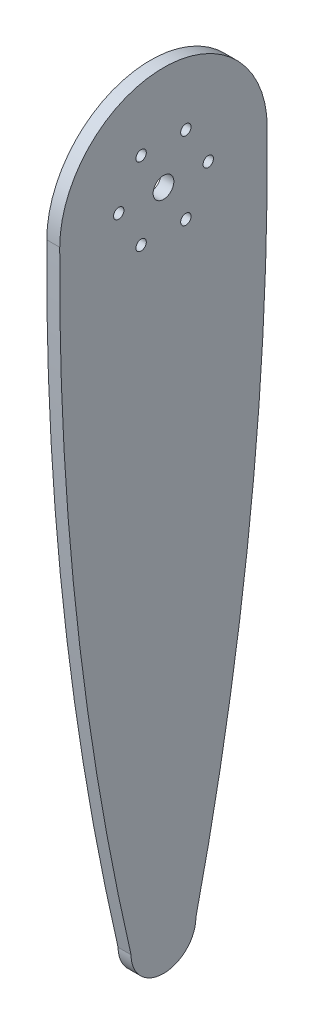
ISO-10303-21;
HEADER;
FILE_DESCRIPTION(('STEP AP214'),'2;1');
FILE_NAME('part.step','',(''),(''),'','','');
FILE_SCHEMA(('AUTOMOTIVE_DESIGN { 1 0 10303 214 1 1 1 1 }'));
ENDSEC;
DATA;
#1=APPLICATION_CONTEXT('core data for automotive mechanical design processes');
#2=APPLICATION_PROTOCOL_DEFINITION('international standard','automotive_design',2000,#1);
#3=PRODUCT_CONTEXT('',#1,'mechanical');
#4=PRODUCT('Part','Part','',(#3));
#5=PRODUCT_RELATED_PRODUCT_CATEGORY('part','',(#4));
#6=PRODUCT_DEFINITION_FORMATION('','',#4);
#7=PRODUCT_DEFINITION_CONTEXT('part definition',#1,'design');
#8=PRODUCT_DEFINITION('design','',#6,#7);
#9=PRODUCT_DEFINITION_SHAPE('','',#8);
#10=(LENGTH_UNIT() NAMED_UNIT(*) SI_UNIT(.MILLI.,.METRE.));
#11=(NAMED_UNIT(*) PLANE_ANGLE_UNIT() SI_UNIT($,.RADIAN.));
#12=(NAMED_UNIT(*) SI_UNIT($,.STERADIAN.) SOLID_ANGLE_UNIT());
#13=UNCERTAINTY_MEASURE_WITH_UNIT(LENGTH_MEASURE(1.E-05),#10,'distance_accuracy_value','');
#14=(GEOMETRIC_REPRESENTATION_CONTEXT(3) GLOBAL_UNCERTAINTY_ASSIGNED_CONTEXT((#13)) GLOBAL_UNIT_ASSIGNED_CONTEXT((#10,
#11,#12)) REPRESENTATION_CONTEXT('',''));
#15=CARTESIAN_POINT('',(0.,0.,0.));
#16=DIRECTION('',(0.,0.,1.));
#17=DIRECTION('',(1.,0.,0.));
#18=AXIS2_PLACEMENT_3D('',#15,#16,#17);
#19=CARTESIAN_POINT('',(5.,241.946907064905,-1036.90370059005));
#20=DIRECTION('',(-1.,0.,0.));
#21=DIRECTION('',(0.,0.,1.));
#22=AXIS2_PLACEMENT_3D('',#19,#20,#21);
#23=CYLINDRICAL_SURFACE('',#22,1076.93381071);
#24=CARTESIAN_POINT('',(0.,241.946907064905,-1036.90370059005));
#25=DIRECTION('',(1.,0.,0.));
#26=DIRECTION('',(0.,0.,-1.));
#27=AXIS2_PLACEMENT_3D('',#24,#25,#26);
#28=CIRCLE('',#27,1076.93381071);
#29=CARTESIAN_POINT('',(0.,250.,40.));
#30=VERTEX_POINT('',#29);
#31=CARTESIAN_POINT('',(0.,0.,12.5));
#32=VERTEX_POINT('',#31);
#33=EDGE_CURVE('E104',#30,#32,#28,.T.);
#34=ORIENTED_EDGE('',*,*,#33,.T.);
#35=DIRECTION('',(-1.,0.,0.));
#36=VECTOR('',#35,1.);
#37=CARTESIAN_POINT('',(5.,0.,12.5));
#38=LINE('',#37,#36);
#39=CARTESIAN_POINT('',(5.,0.,12.5));
#40=VERTEX_POINT('',#39);
#41=EDGE_CURVE('E11',#40,#32,#38,.T.);
#42=ORIENTED_EDGE('',*,*,#41,.F.);
#43=CARTESIAN_POINT('',(5.,241.946907064905,-1036.90370059005));
#44=DIRECTION('',(1.,0.,0.));
#45=DIRECTION('',(0.,0.,-1.));
#46=AXIS2_PLACEMENT_3D('',#43,#44,#45);
#47=CIRCLE('',#46,1076.93381071);
#48=CARTESIAN_POINT('',(5.,250.,40.));
#49=VERTEX_POINT('',#48);
#50=EDGE_CURVE('E92',#49,#40,#47,.T.);
#51=ORIENTED_EDGE('',*,*,#50,.F.);
#52=DIRECTION('',(-1.,0.,0.));
#53=VECTOR('',#52,1.);
#54=CARTESIAN_POINT('',(5.,250.,40.));
#55=LINE('',#54,#53);
#56=EDGE_CURVE('E100',#49,#30,#55,.T.);
#57=ORIENTED_EDGE('',*,*,#56,.T.);
#58=EDGE_LOOP('',(#34,#42,#51,#57));
#59=FACE_BOUND('',#58,.T.);
#60=ADVANCED_FACE('F41',(#59),#23,.T.);
#61=CARTESIAN_POINT('',(5.,0.,0.));
#62=DIRECTION('',(-1.,0.,0.));
#63=DIRECTION('',(0.,0.,1.));
#64=AXIS2_PLACEMENT_3D('',#61,#62,#63);
#65=CYLINDRICAL_SURFACE('',#64,12.5);
#66=CARTESIAN_POINT('',(0.,0.,0.));
#67=DIRECTION('',(1.,0.,0.));
#68=DIRECTION('',(0.,0.,-1.));
#69=AXIS2_PLACEMENT_3D('',#66,#67,#68);
#70=CIRCLE('',#69,12.5);
#71=CARTESIAN_POINT('',(0.,3.88578058618805E-13,-12.5000000000002));
#72=VERTEX_POINT('',#71);
#73=EDGE_CURVE('E96',#32,#72,#70,.T.);
#74=ORIENTED_EDGE('',*,*,#73,.T.);
#75=DIRECTION('',(-1.,0.,0.));
#76=VECTOR('',#75,1.);
#77=CARTESIAN_POINT('',(5.,3.88578058618805E-13,-12.5000000000002));
#78=LINE('',#77,#76);
#79=CARTESIAN_POINT('',(5.,3.88578058618805E-13,-12.5000000000002));
#80=VERTEX_POINT('',#79);
#81=EDGE_CURVE('E49',#80,#72,#78,.T.);
#82=ORIENTED_EDGE('',*,*,#81,.F.);
#83=CARTESIAN_POINT('',(5.,0.,0.));
#84=DIRECTION('',(1.,0.,0.));
#85=DIRECTION('',(0.,0.,-1.));
#86=AXIS2_PLACEMENT_3D('',#83,#84,#85);
#87=CIRCLE('',#86,12.5);
#88=EDGE_CURVE('E87',#40,#80,#87,.T.);
#89=ORIENTED_EDGE('',*,*,#88,.F.);
#90=ORIENTED_EDGE('',*,*,#41,.T.);
#91=EDGE_LOOP('',(#74,#82,#89,#90));
#92=FACE_BOUND('',#91,.T.);
#93=ADVANCED_FACE('F95',(#92),#65,.T.);
#94=CARTESIAN_POINT('',(5.,241.946907064905,1036.90370059005));
#95=DIRECTION('',(-1.,0.,0.));
#96=DIRECTION('',(0.,0.,1.));
#97=AXIS2_PLACEMENT_3D('',#94,#95,#96);
#98=CYLINDRICAL_SURFACE('',#97,1076.93381071);
#99=CARTESIAN_POINT('',(0.,241.946907064905,1036.90370059005));
#100=DIRECTION('',(1.,0.,0.));
#101=DIRECTION('',(0.,0.,1.));
#102=AXIS2_PLACEMENT_3D('',#99,#100,#101);
#103=CIRCLE('',#102,1076.93381071);
#104=CARTESIAN_POINT('',(0.,250.,-40.));
#105=VERTEX_POINT('',#104);
#106=EDGE_CURVE('E74',#72,#105,#103,.T.);
#107=ORIENTED_EDGE('',*,*,#106,.T.);
#108=DIRECTION('',(-1.,0.,0.));
#109=VECTOR('',#108,1.);
#110=CARTESIAN_POINT('',(5.,250.,-40.));
#111=LINE('',#110,#109);
#112=CARTESIAN_POINT('',(5.,250.,-40.));
#113=VERTEX_POINT('',#112);
#114=EDGE_CURVE('E97',#113,#105,#111,.T.);
#115=ORIENTED_EDGE('',*,*,#114,.F.);
#116=CARTESIAN_POINT('',(5.,241.946907064905,1036.90370059005));
#117=DIRECTION('',(1.,0.,0.));
#118=DIRECTION('',(0.,0.,1.));
#119=AXIS2_PLACEMENT_3D('',#116,#117,#118);
#120=CIRCLE('',#119,1076.93381071);
#121=EDGE_CURVE('E90',#80,#113,#120,.T.);
#122=ORIENTED_EDGE('',*,*,#121,.F.);
#123=ORIENTED_EDGE('',*,*,#81,.T.);
#124=EDGE_LOOP('',(#107,#115,#122,#123));
#125=FACE_BOUND('',#124,.T.);
#126=ADVANCED_FACE('F98',(#125),#98,.T.);
#127=CARTESIAN_POINT('',(5.,250.,0.));
#128=DIRECTION('',(-1.,0.,0.));
#129=DIRECTION('',(0.,0.,1.));
#130=AXIS2_PLACEMENT_3D('',#127,#128,#129);
#131=CYLINDRICAL_SURFACE('',#130,40.);
#132=CARTESIAN_POINT('',(0.,250.,0.));
#133=DIRECTION('',(1.,0.,0.));
#134=DIRECTION('',(0.,0.,-1.));
#135=AXIS2_PLACEMENT_3D('',#132,#133,#134);
#136=CIRCLE('',#135,40.);
#137=EDGE_CURVE('E80',#105,#30,#136,.T.);
#138=ORIENTED_EDGE('',*,*,#137,.T.);
#139=ORIENTED_EDGE('',*,*,#56,.F.);
#140=CARTESIAN_POINT('',(5.,250.,0.));
#141=DIRECTION('',(1.,0.,0.));
#142=DIRECTION('',(0.,0.,-1.));
#143=AXIS2_PLACEMENT_3D('',#140,#141,#142);
#144=CIRCLE('',#143,40.);
#145=EDGE_CURVE('E57',#113,#49,#144,.T.);
#146=ORIENTED_EDGE('',*,*,#145,.F.);
#147=ORIENTED_EDGE('',*,*,#114,.T.);
#148=EDGE_LOOP('',(#138,#139,#146,#147));
#149=FACE_BOUND('',#148,.T.);
#150=ADVANCED_FACE('F112',(#149),#131,.T.);
#151=CARTESIAN_POINT('',(5.,120.973453532453,-518.451850295024));
#152=DIRECTION('',(1.,0.,0.));
#153=DIRECTION('',(0.,0.,-1.));
#154=AXIS2_PLACEMENT_3D('',#151,#152,#153);
#155=PLANE('',#154);
#156=CARTESIAN_POINT('',(5.,264.938938215281,8.62500000000019));
#157=DIRECTION('',(-1.,0.,0.));
#158=DIRECTION('',(0.,0.,1.));
#159=AXIS2_PLACEMENT_3D('',#156,#157,#158);
#160=CIRCLE('',#159,2.);
#161=CARTESIAN_POINT('',(5.,264.938938215281,10.6250000000002));
#162=VERTEX_POINT('',#161);
#163=EDGE_CURVE('E124',#162,#162,#160,.T.);
#164=ORIENTED_EDGE('',*,*,#163,.T.);
#165=EDGE_LOOP('',(#164));
#166=FACE_BOUND('',#165,.T.);
#167=CARTESIAN_POINT('',(5.,264.938938215282,-8.62499999999985));
#168=DIRECTION('',(-1.,0.,0.));
#169=DIRECTION('',(0.,0.,1.));
#170=AXIS2_PLACEMENT_3D('',#167,#168,#169);
#171=CIRCLE('',#170,2.00000000000003);
#172=CARTESIAN_POINT('',(5.,264.938938215282,-6.62499999999982));
#173=VERTEX_POINT('',#172);
#174=EDGE_CURVE('E130',#173,#173,#171,.T.);
#175=ORIENTED_EDGE('',*,*,#174,.T.);
#176=EDGE_LOOP('',(#175));
#177=FACE_BOUND('',#176,.T.);
#178=CARTESIAN_POINT('',(5.,250.,-17.25));
#179=DIRECTION('',(-1.,0.,0.));
#180=DIRECTION('',(0.,0.,1.));
#181=AXIS2_PLACEMENT_3D('',#178,#179,#180);
#182=CIRCLE('',#181,2.);
#183=CARTESIAN_POINT('',(5.,250.,-15.25));
#184=VERTEX_POINT('',#183);
#185=EDGE_CURVE('E136',#184,#184,#182,.T.);
#186=ORIENTED_EDGE('',*,*,#185,.T.);
#187=EDGE_LOOP('',(#186));
#188=FACE_BOUND('',#187,.T.);
#189=CARTESIAN_POINT('',(5.,235.061061784719,-8.62500000000008));
#190=DIRECTION('',(-1.,0.,0.));
#191=DIRECTION('',(0.,0.,1.));
#192=AXIS2_PLACEMENT_3D('',#189,#190,#191);
#193=CIRCLE('',#192,2.);
#194=CARTESIAN_POINT('',(5.,235.061061784719,-6.62500000000008));
#195=VERTEX_POINT('',#194);
#196=EDGE_CURVE('E142',#195,#195,#193,.T.);
#197=ORIENTED_EDGE('',*,*,#196,.T.);
#198=EDGE_LOOP('',(#197));
#199=FACE_BOUND('',#198,.T.);
#200=CARTESIAN_POINT('',(5.,235.061061784718,8.62499999999994));
#201=DIRECTION('',(-1.,0.,0.));
#202=DIRECTION('',(0.,0.,1.));
#203=AXIS2_PLACEMENT_3D('',#200,#201,#202);
#204=CIRCLE('',#203,2.);
#205=CARTESIAN_POINT('',(5.,235.061061784718,10.6249999999999));
#206=VERTEX_POINT('',#205);
#207=EDGE_CURVE('E148',#206,#206,#204,.T.);
#208=ORIENTED_EDGE('',*,*,#207,.T.);
#209=EDGE_LOOP('',(#208));
#210=FACE_BOUND('',#209,.T.);
#211=CARTESIAN_POINT('',(5.,250.,17.25));
#212=DIRECTION('',(-1.,0.,0.));
#213=DIRECTION('',(0.,0.,1.));
#214=AXIS2_PLACEMENT_3D('',#211,#212,#213);
#215=CIRCLE('',#214,2.);
#216=CARTESIAN_POINT('',(5.,250.,19.25));
#217=VERTEX_POINT('',#216);
#218=EDGE_CURVE('E154',#217,#217,#215,.T.);
#219=ORIENTED_EDGE('',*,*,#218,.T.);
#220=EDGE_LOOP('',(#219));
#221=FACE_BOUND('',#220,.T.);
#222=CARTESIAN_POINT('',(5.,250.,0.));
#223=DIRECTION('',(-1.,0.,0.));
#224=DIRECTION('',(0.,0.,1.));
#225=AXIS2_PLACEMENT_3D('',#222,#223,#224);
#226=CIRCLE('',#225,4.);
#227=CARTESIAN_POINT('',(5.,250.,4.));
#228=VERTEX_POINT('',#227);
#229=EDGE_CURVE('E107',#228,#228,#226,.T.);
#230=ORIENTED_EDGE('',*,*,#229,.T.);
#231=EDGE_LOOP('',(#230));
#232=FACE_BOUND('',#231,.T.);
#233=ORIENTED_EDGE('',*,*,#50,.T.);
#234=ORIENTED_EDGE('',*,*,#88,.T.);
#235=ORIENTED_EDGE('',*,*,#121,.T.);
#236=ORIENTED_EDGE('',*,*,#145,.T.);
#237=EDGE_LOOP('',(#233,#234,#235,#236));
#238=FACE_BOUND('',#237,.T.);
#239=ADVANCED_FACE('F88',(#166,#177,#188,#199,#210,#221,#232,#238),#155,.T.);
#240=CARTESIAN_POINT('',(0.,120.973453532453,-518.451850295024));
#241=DIRECTION('',(1.,0.,0.));
#242=DIRECTION('',(0.,0.,-1.));
#243=AXIS2_PLACEMENT_3D('',#240,#241,#242);
#244=PLANE('',#243);
#245=CARTESIAN_POINT('',(0.,264.938938215281,8.62500000000019));
#246=DIRECTION('',(-1.,0.,0.));
#247=DIRECTION('',(0.,0.,1.));
#248=AXIS2_PLACEMENT_3D('',#245,#246,#247);
#249=CIRCLE('',#248,2.);
#250=CARTESIAN_POINT('',(0.,264.938938215281,10.6250000000002));
#251=VERTEX_POINT('',#250);
#252=EDGE_CURVE('E127',#251,#251,#249,.T.);
#253=ORIENTED_EDGE('',*,*,#252,.F.);
#254=EDGE_LOOP('',(#253));
#255=FACE_BOUND('',#254,.T.);
#256=CARTESIAN_POINT('',(0.,264.938938215282,-8.62499999999985));
#257=DIRECTION('',(-1.,0.,0.));
#258=DIRECTION('',(0.,0.,1.));
#259=AXIS2_PLACEMENT_3D('',#256,#257,#258);
#260=CIRCLE('',#259,2.00000000000003);
#261=CARTESIAN_POINT('',(0.,264.938938215282,-6.62499999999982));
#262=VERTEX_POINT('',#261);
#263=EDGE_CURVE('E133',#262,#262,#260,.T.);
#264=ORIENTED_EDGE('',*,*,#263,.F.);
#265=EDGE_LOOP('',(#264));
#266=FACE_BOUND('',#265,.T.);
#267=CARTESIAN_POINT('',(0.,250.,-17.25));
#268=DIRECTION('',(-1.,0.,0.));
#269=DIRECTION('',(0.,0.,1.));
#270=AXIS2_PLACEMENT_3D('',#267,#268,#269);
#271=CIRCLE('',#270,2.);
#272=CARTESIAN_POINT('',(0.,250.,-15.25));
#273=VERTEX_POINT('',#272);
#274=EDGE_CURVE('E139',#273,#273,#271,.T.);
#275=ORIENTED_EDGE('',*,*,#274,.F.);
#276=EDGE_LOOP('',(#275));
#277=FACE_BOUND('',#276,.T.);
#278=CARTESIAN_POINT('',(0.,235.061061784719,-8.62500000000008));
#279=DIRECTION('',(-1.,0.,0.));
#280=DIRECTION('',(0.,0.,1.));
#281=AXIS2_PLACEMENT_3D('',#278,#279,#280);
#282=CIRCLE('',#281,2.);
#283=CARTESIAN_POINT('',(0.,235.061061784719,-6.62500000000008));
#284=VERTEX_POINT('',#283);
#285=EDGE_CURVE('E145',#284,#284,#282,.T.);
#286=ORIENTED_EDGE('',*,*,#285,.F.);
#287=EDGE_LOOP('',(#286));
#288=FACE_BOUND('',#287,.T.);
#289=CARTESIAN_POINT('',(0.,235.061061784718,8.62499999999994));
#290=DIRECTION('',(-1.,0.,0.));
#291=DIRECTION('',(0.,0.,1.));
#292=AXIS2_PLACEMENT_3D('',#289,#290,#291);
#293=CIRCLE('',#292,2.);
#294=CARTESIAN_POINT('',(0.,235.061061784718,10.6249999999999));
#295=VERTEX_POINT('',#294);
#296=EDGE_CURVE('E151',#295,#295,#293,.T.);
#297=ORIENTED_EDGE('',*,*,#296,.F.);
#298=EDGE_LOOP('',(#297));
#299=FACE_BOUND('',#298,.T.);
#300=CARTESIAN_POINT('',(0.,250.,17.25));
#301=DIRECTION('',(-1.,0.,0.));
#302=DIRECTION('',(0.,0.,1.));
#303=AXIS2_PLACEMENT_3D('',#300,#301,#302);
#304=CIRCLE('',#303,2.);
#305=CARTESIAN_POINT('',(0.,250.,19.25));
#306=VERTEX_POINT('',#305);
#307=EDGE_CURVE('E121',#306,#306,#304,.T.);
#308=ORIENTED_EDGE('',*,*,#307,.F.);
#309=EDGE_LOOP('',(#308));
#310=FACE_BOUND('',#309,.T.);
#311=CARTESIAN_POINT('',(0.,250.,0.));
#312=DIRECTION('',(-1.,0.,0.));
#313=DIRECTION('',(0.,0.,1.));
#314=AXIS2_PLACEMENT_3D('',#311,#312,#313);
#315=CIRCLE('',#314,4.);
#316=CARTESIAN_POINT('',(0.,250.,4.));
#317=VERTEX_POINT('',#316);
#318=EDGE_CURVE('E118',#317,#317,#315,.T.);
#319=ORIENTED_EDGE('',*,*,#318,.F.);
#320=EDGE_LOOP('',(#319));
#321=FACE_BOUND('',#320,.T.);
#322=ORIENTED_EDGE('',*,*,#33,.F.);
#323=ORIENTED_EDGE('',*,*,#137,.F.);
#324=ORIENTED_EDGE('',*,*,#106,.F.);
#325=ORIENTED_EDGE('',*,*,#73,.F.);
#326=EDGE_LOOP('',(#322,#323,#324,#325));
#327=FACE_BOUND('',#326,.T.);
#328=ADVANCED_FACE('F115',(#255,#266,#277,#288,#299,#310,#321,#327),#244,.F.);
#329=CARTESIAN_POINT('',(5.,250.,0.));
#330=DIRECTION('',(-1.,0.,0.));
#331=DIRECTION('',(0.,0.,1.));
#332=AXIS2_PLACEMENT_3D('',#329,#330,#331);
#333=CYLINDRICAL_SURFACE('',#332,4.);
#334=ORIENTED_EDGE('',*,*,#229,.F.);
#335=EDGE_LOOP('',(#334));
#336=FACE_BOUND('',#335,.T.);
#337=ORIENTED_EDGE('',*,*,#318,.T.);
#338=EDGE_LOOP('',(#337));
#339=FACE_BOUND('',#338,.T.);
#340=ADVANCED_FACE('F164',(#336,#339),#333,.F.);
#341=CARTESIAN_POINT('',(5.,250.,17.25));
#342=DIRECTION('',(-1.,0.,0.));
#343=DIRECTION('',(0.,0.,1.));
#344=AXIS2_PLACEMENT_3D('',#341,#342,#343);
#345=CYLINDRICAL_SURFACE('',#344,2.);
#346=ORIENTED_EDGE('',*,*,#218,.F.);
#347=EDGE_LOOP('',(#346));
#348=FACE_BOUND('',#347,.T.);
#349=ORIENTED_EDGE('',*,*,#307,.T.);
#350=EDGE_LOOP('',(#349));
#351=FACE_BOUND('',#350,.T.);
#352=ADVANCED_FACE('F160',(#348,#351),#345,.F.);
#353=CARTESIAN_POINT('',(5.,235.061061784718,8.62499999999994));
#354=DIRECTION('',(-1.,0.,0.));
#355=DIRECTION('',(0.,0.,1.));
#356=AXIS2_PLACEMENT_3D('',#353,#354,#355);
#357=CYLINDRICAL_SURFACE('',#356,2.);
#358=ORIENTED_EDGE('',*,*,#207,.F.);
#359=EDGE_LOOP('',(#358));
#360=FACE_BOUND('',#359,.T.);
#361=ORIENTED_EDGE('',*,*,#296,.T.);
#362=EDGE_LOOP('',(#361));
#363=FACE_BOUND('',#362,.T.);
#364=ADVANCED_FACE('F175',(#360,#363),#357,.F.);
#365=CARTESIAN_POINT('',(5.,235.061061784719,-8.62500000000008));
#366=DIRECTION('',(-1.,0.,0.));
#367=DIRECTION('',(0.,0.,1.));
#368=AXIS2_PLACEMENT_3D('',#365,#366,#367);
#369=CYLINDRICAL_SURFACE('',#368,2.);
#370=ORIENTED_EDGE('',*,*,#196,.F.);
#371=EDGE_LOOP('',(#370));
#372=FACE_BOUND('',#371,.T.);
#373=ORIENTED_EDGE('',*,*,#285,.T.);
#374=EDGE_LOOP('',(#373));
#375=FACE_BOUND('',#374,.T.);
#376=ADVANCED_FACE('F210',(#372,#375),#369,.F.);
#377=CARTESIAN_POINT('',(5.,250.,-17.25));
#378=DIRECTION('',(-1.,0.,0.));
#379=DIRECTION('',(0.,0.,1.));
#380=AXIS2_PLACEMENT_3D('',#377,#378,#379);
#381=CYLINDRICAL_SURFACE('',#380,2.);
#382=ORIENTED_EDGE('',*,*,#185,.F.);
#383=EDGE_LOOP('',(#382));
#384=FACE_BOUND('',#383,.T.);
#385=ORIENTED_EDGE('',*,*,#274,.T.);
#386=EDGE_LOOP('',(#385));
#387=FACE_BOUND('',#386,.T.);
#388=ADVANCED_FACE('F217',(#384,#387),#381,.F.);
#389=CARTESIAN_POINT('',(5.,264.938938215282,-8.62499999999985));
#390=DIRECTION('',(-1.,0.,0.));
#391=DIRECTION('',(0.,0.,1.));
#392=AXIS2_PLACEMENT_3D('',#389,#390,#391);
#393=CYLINDRICAL_SURFACE('',#392,2.00000000000003);
#394=ORIENTED_EDGE('',*,*,#174,.F.);
#395=EDGE_LOOP('',(#394));
#396=FACE_BOUND('',#395,.T.);
#397=ORIENTED_EDGE('',*,*,#263,.T.);
#398=EDGE_LOOP('',(#397));
#399=FACE_BOUND('',#398,.T.);
#400=ADVANCED_FACE('F223',(#396,#399),#393,.F.);
#401=CARTESIAN_POINT('',(5.,264.938938215281,8.62500000000019));
#402=DIRECTION('',(-1.,0.,0.));
#403=DIRECTION('',(0.,0.,1.));
#404=AXIS2_PLACEMENT_3D('',#401,#402,#403);
#405=CYLINDRICAL_SURFACE('',#404,2.);
#406=ORIENTED_EDGE('',*,*,#163,.F.);
#407=EDGE_LOOP('',(#406));
#408=FACE_BOUND('',#407,.T.);
#409=ORIENTED_EDGE('',*,*,#252,.T.);
#410=EDGE_LOOP('',(#409));
#411=FACE_BOUND('',#410,.T.);
#412=ADVANCED_FACE('F226',(#408,#411),#405,.F.);
#413=CLOSED_SHELL('',(#60,#93,#126,#150,#239,#328,#340,#352,#364,#376,#388,#400,#412));
#414=MANIFOLD_SOLID_BREP('B2',#413);
#415=ADVANCED_BREP_SHAPE_REPRESENTATION('',(#18,#414),#14);
#416=SHAPE_DEFINITION_REPRESENTATION(#9,#415);
ENDSEC;
END-ISO-10303-21;
